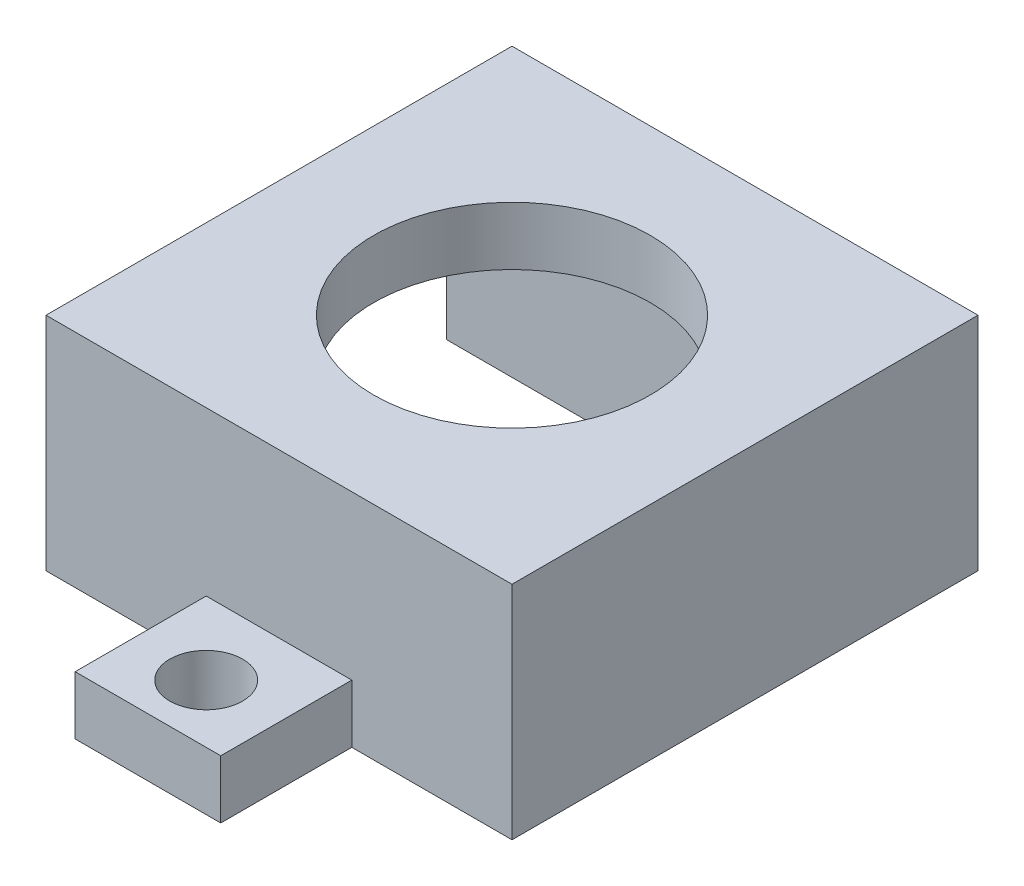
ISO-10303-21;
HEADER;
FILE_DESCRIPTION(('STEP AP214'),'2;1');
FILE_NAME('part.step','',(''),(''),'','','');
FILE_SCHEMA(('AUTOMOTIVE_DESIGN { 1 0 10303 214 1 1 1 1 }'));
ENDSEC;
DATA;
#1=APPLICATION_CONTEXT('core data for automotive mechanical design processes');
#2=APPLICATION_PROTOCOL_DEFINITION('international standard','automotive_design',2000,#1);
#3=PRODUCT_CONTEXT('',#1,'mechanical');
#4=PRODUCT('Part','Part','',(#3));
#5=PRODUCT_RELATED_PRODUCT_CATEGORY('part','',(#4));
#6=PRODUCT_DEFINITION_FORMATION('','',#4);
#7=PRODUCT_DEFINITION_CONTEXT('part definition',#1,'design');
#8=PRODUCT_DEFINITION('design','',#6,#7);
#9=PRODUCT_DEFINITION_SHAPE('','',#8);
#10=(LENGTH_UNIT() NAMED_UNIT(*) SI_UNIT(.MILLI.,.METRE.));
#11=(NAMED_UNIT(*) PLANE_ANGLE_UNIT() SI_UNIT($,.RADIAN.));
#12=(NAMED_UNIT(*) SI_UNIT($,.STERADIAN.) SOLID_ANGLE_UNIT());
#13=UNCERTAINTY_MEASURE_WITH_UNIT(LENGTH_MEASURE(1.E-05),#10,'distance_accuracy_value','');
#14=(GEOMETRIC_REPRESENTATION_CONTEXT(3) GLOBAL_UNCERTAINTY_ASSIGNED_CONTEXT((#13)) GLOBAL_UNIT_ASSIGNED_CONTEXT((#10,
#11,#12)) REPRESENTATION_CONTEXT('',''));
#15=CARTESIAN_POINT('',(0.,0.,0.));
#16=DIRECTION('',(0.,0.,1.));
#17=DIRECTION('',(1.,0.,0.));
#18=AXIS2_PLACEMENT_3D('',#15,#16,#17);
#19=CARTESIAN_POINT('',(-8.,7.6,8.));
#20=DIRECTION('',(0.,0.,-1.));
#21=DIRECTION('',(-1.,0.,0.));
#22=AXIS2_PLACEMENT_3D('',#19,#20,#21);
#23=PLANE('',#22);
#24=DIRECTION('',(0.,-1.,0.));
#25=VECTOR('',#24,1.);
#26=CARTESIAN_POINT('',(-2.5,2.,8.));
#27=LINE('',#26,#25);
#28=CARTESIAN_POINT('',(-2.5,2.,8.));
#29=VERTEX_POINT('',#28);
#30=CARTESIAN_POINT('',(-2.5,0.,8.));
#31=VERTEX_POINT('',#30);
#32=EDGE_CURVE('E195',#29,#31,#27,.T.);
#33=ORIENTED_EDGE('',*,*,#32,.F.);
#34=DIRECTION('',(1.,0.,0.));
#35=VECTOR('',#34,1.);
#36=CARTESIAN_POINT('',(-2.5,2.,8.));
#37=LINE('',#36,#35);
#38=CARTESIAN_POINT('',(2.5,2.,8.));
#39=VERTEX_POINT('',#38);
#40=EDGE_CURVE('E181',#29,#39,#37,.T.);
#41=ORIENTED_EDGE('',*,*,#40,.T.);
#42=DIRECTION('',(0.,-1.,0.));
#43=VECTOR('',#42,1.);
#44=CARTESIAN_POINT('',(2.5,2.,8.));
#45=LINE('',#44,#43);
#46=CARTESIAN_POINT('',(2.5,0.,8.));
#47=VERTEX_POINT('',#46);
#48=EDGE_CURVE('E206',#39,#47,#45,.T.);
#49=ORIENTED_EDGE('',*,*,#48,.T.);
#50=DIRECTION('',(1.,0.,0.));
#51=VECTOR('',#50,1.);
#52=CARTESIAN_POINT('',(-8.,0.,8.));
#53=LINE('',#52,#51);
#54=CARTESIAN_POINT('',(8.,0.,8.));
#55=VERTEX_POINT('',#54);
#56=EDGE_CURVE('E313',#47,#55,#53,.T.);
#57=ORIENTED_EDGE('',*,*,#56,.T.);
#58=DIRECTION('',(0.,-1.,0.));
#59=VECTOR('',#58,1.);
#60=CARTESIAN_POINT('',(8.,7.6,8.));
#61=LINE('',#60,#59);
#62=CARTESIAN_POINT('',(8.,7.6,8.));
#63=VERTEX_POINT('',#62);
#64=EDGE_CURVE('E53',#63,#55,#61,.T.);
#65=ORIENTED_EDGE('',*,*,#64,.F.);
#66=DIRECTION('',(1.,0.,0.));
#67=VECTOR('',#66,1.);
#68=CARTESIAN_POINT('',(-8.,7.6,8.));
#69=LINE('',#68,#67);
#70=CARTESIAN_POINT('',(-8.,7.6,8.));
#71=VERTEX_POINT('',#70);
#72=EDGE_CURVE('E298',#71,#63,#69,.T.);
#73=ORIENTED_EDGE('',*,*,#72,.F.);
#74=DIRECTION('',(0.,-1.,0.));
#75=VECTOR('',#74,1.);
#76=CARTESIAN_POINT('',(-8.,7.6,8.));
#77=LINE('',#76,#75);
#78=CARTESIAN_POINT('',(-8.,0.,8.));
#79=VERTEX_POINT('',#78);
#80=EDGE_CURVE('E11',#71,#79,#77,.T.);
#81=ORIENTED_EDGE('',*,*,#80,.T.);
#82=EDGE_CURVE('E314',#79,#31,#53,.T.);
#83=ORIENTED_EDGE('',*,*,#82,.T.);
#84=EDGE_LOOP('',(#33,#41,#49,#57,#65,#73,#81,#83));
#85=FACE_BOUND('',#84,.T.);
#86=ADVANCED_FACE('F43',(#85),#23,.F.);
#87=CARTESIAN_POINT('',(-8.,7.6,-8.));
#88=DIRECTION('',(0.,0.,1.));
#89=DIRECTION('',(1.,0.,0.));
#90=AXIS2_PLACEMENT_3D('',#87,#88,#89);
#91=PLANE('',#90);
#92=DIRECTION('',(0.,-1.,0.));
#93=VECTOR('',#92,1.);
#94=CARTESIAN_POINT('',(2.5,2.,-8.));
#95=LINE('',#94,#93);
#96=CARTESIAN_POINT('',(2.5,2.,-8.));
#97=VERTEX_POINT('',#96);
#98=CARTESIAN_POINT('',(2.5,0.,-8.));
#99=VERTEX_POINT('',#98);
#100=EDGE_CURVE('E245',#97,#99,#95,.T.);
#101=ORIENTED_EDGE('',*,*,#100,.F.);
#102=DIRECTION('',(1.,0.,0.));
#103=VECTOR('',#102,1.);
#104=CARTESIAN_POINT('',(-2.5,2.,-8.));
#105=LINE('',#104,#103);
#106=CARTESIAN_POINT('',(-2.5,2.,-8.));
#107=VERTEX_POINT('',#106);
#108=EDGE_CURVE('E221',#107,#97,#105,.T.);
#109=ORIENTED_EDGE('',*,*,#108,.F.);
#110=DIRECTION('',(0.,-1.,0.));
#111=VECTOR('',#110,1.);
#112=CARTESIAN_POINT('',(-2.5,2.,-8.));
#113=LINE('',#112,#111);
#114=CARTESIAN_POINT('',(-2.5,0.,-8.));
#115=VERTEX_POINT('',#114);
#116=EDGE_CURVE('E248',#107,#115,#113,.T.);
#117=ORIENTED_EDGE('',*,*,#116,.T.);
#118=DIRECTION('',(-1.,0.,0.));
#119=VECTOR('',#118,1.);
#120=CARTESIAN_POINT('',(-8.,0.,-8.));
#121=LINE('',#120,#119);
#122=CARTESIAN_POINT('',(-8.,0.,-8.));
#123=VERTEX_POINT('',#122);
#124=EDGE_CURVE('E321',#115,#123,#121,.T.);
#125=ORIENTED_EDGE('',*,*,#124,.T.);
#126=DIRECTION('',(0.,-1.,0.));
#127=VECTOR('',#126,1.);
#128=CARTESIAN_POINT('',(-8.,7.6,-8.));
#129=LINE('',#128,#127);
#130=CARTESIAN_POINT('',(-8.,7.6,-8.));
#131=VERTEX_POINT('',#130);
#132=EDGE_CURVE('E308',#131,#123,#129,.T.);
#133=ORIENTED_EDGE('',*,*,#132,.F.);
#134=DIRECTION('',(-1.,0.,0.));
#135=VECTOR('',#134,1.);
#136=CARTESIAN_POINT('',(-8.,7.6,-8.));
#137=LINE('',#136,#135);
#138=CARTESIAN_POINT('',(8.,7.6,-8.));
#139=VERTEX_POINT('',#138);
#140=EDGE_CURVE('E305',#139,#131,#137,.T.);
#141=ORIENTED_EDGE('',*,*,#140,.F.);
#142=DIRECTION('',(0.,-1.,0.));
#143=VECTOR('',#142,1.);
#144=CARTESIAN_POINT('',(8.,7.6,-8.));
#145=LINE('',#144,#143);
#146=CARTESIAN_POINT('',(8.,0.,-8.));
#147=VERTEX_POINT('',#146);
#148=EDGE_CURVE('E328',#139,#147,#145,.T.);
#149=ORIENTED_EDGE('',*,*,#148,.T.);
#150=EDGE_CURVE('E299',#147,#99,#121,.T.);
#151=ORIENTED_EDGE('',*,*,#150,.T.);
#152=EDGE_LOOP('',(#101,#109,#117,#125,#133,#141,#149,#151));
#153=FACE_BOUND('',#152,.T.);
#154=ADVANCED_FACE('F350',(#153),#91,.F.);
#155=CARTESIAN_POINT('',(0.,0.,0.));
#156=DIRECTION('',(0.,1.,0.));
#157=DIRECTION('',(0.,0.,1.));
#158=AXIS2_PLACEMENT_3D('',#155,#156,#157);
#159=PLANE('',#158);
#160=CARTESIAN_POINT('',(0.,0.,10.5));
#161=DIRECTION('',(0.,1.,0.));
#162=DIRECTION('',(0.,0.,1.));
#163=AXIS2_PLACEMENT_3D('',#160,#161,#162);
#164=CIRCLE('',#163,1.25);
#165=CARTESIAN_POINT('',(0.,0.,11.75));
#166=VERTEX_POINT('',#165);
#167=EDGE_CURVE('E509',#166,#166,#164,.T.);
#168=ORIENTED_EDGE('',*,*,#167,.T.);
#169=EDGE_LOOP('',(#168));
#170=FACE_BOUND('',#169,.T.);
#171=CARTESIAN_POINT('',(0.,0.,-10.5));
#172=DIRECTION('',(0.,1.,0.));
#173=DIRECTION('',(0.,0.,1.));
#174=AXIS2_PLACEMENT_3D('',#171,#172,#173);
#175=CIRCLE('',#174,1.25);
#176=CARTESIAN_POINT('',(0.,0.,-9.25));
#177=VERTEX_POINT('',#176);
#178=EDGE_CURVE('E214',#177,#177,#175,.F.);
#179=ORIENTED_EDGE('',*,*,#178,.F.);
#180=EDGE_LOOP('',(#179));
#181=FACE_BOUND('',#180,.T.);
#182=DIRECTION('',(0.,0.,1.));
#183=VECTOR('',#182,1.);
#184=CARTESIAN_POINT('',(-8.,0.,-8.));
#185=LINE('',#184,#183);
#186=CARTESIAN_POINT('',(-8.,0.,5.75));
#187=VERTEX_POINT('',#186);
#188=EDGE_CURVE('E293',#187,#79,#185,.T.);
#189=ORIENTED_EDGE('',*,*,#188,.F.);
#190=DIRECTION('',(1.,0.,0.));
#191=VECTOR('',#190,1.);
#192=CARTESIAN_POINT('',(-5.75,0.,5.75));
#193=LINE('',#192,#191);
#194=CARTESIAN_POINT('',(5.75,0.,5.75));
#195=VERTEX_POINT('',#194);
#196=EDGE_CURVE('E264',#187,#195,#193,.T.);
#197=ORIENTED_EDGE('',*,*,#196,.T.);
#198=DIRECTION('',(0.,0.,-1.));
#199=VECTOR('',#198,1.);
#200=CARTESIAN_POINT('',(5.75,0.,-5.75));
#201=LINE('',#200,#199);
#202=CARTESIAN_POINT('',(5.75,0.,-5.75));
#203=VERTEX_POINT('',#202);
#204=EDGE_CURVE('E282',#195,#203,#201,.T.);
#205=ORIENTED_EDGE('',*,*,#204,.T.);
#206=DIRECTION('',(-1.,0.,0.));
#207=VECTOR('',#206,1.);
#208=CARTESIAN_POINT('',(-5.75,0.,-5.75));
#209=LINE('',#208,#207);
#210=CARTESIAN_POINT('',(-8.,0.,-5.75));
#211=VERTEX_POINT('',#210);
#212=EDGE_CURVE('E272',#203,#211,#209,.T.);
#213=ORIENTED_EDGE('',*,*,#212,.T.);
#214=EDGE_CURVE('E309',#123,#211,#185,.T.);
#215=ORIENTED_EDGE('',*,*,#214,.F.);
#216=ORIENTED_EDGE('',*,*,#124,.F.);
#217=DIRECTION('',(0.,0.,1.));
#218=VECTOR('',#217,1.);
#219=CARTESIAN_POINT('',(-2.5,0.,-8.));
#220=LINE('',#219,#218);
#221=CARTESIAN_POINT('',(-2.5,0.,-12.5));
#222=VERTEX_POINT('',#221);
#223=EDGE_CURVE('E68',#222,#115,#220,.T.);
#224=ORIENTED_EDGE('',*,*,#223,.F.);
#225=DIRECTION('',(-1.,0.,0.));
#226=VECTOR('',#225,1.);
#227=CARTESIAN_POINT('',(-2.5,0.,-12.5));
#228=LINE('',#227,#226);
#229=CARTESIAN_POINT('',(2.5,0.,-12.5));
#230=VERTEX_POINT('',#229);
#231=EDGE_CURVE('E222',#230,#222,#228,.T.);
#232=ORIENTED_EDGE('',*,*,#231,.F.);
#233=DIRECTION('',(0.,0.,-1.));
#234=VECTOR('',#233,1.);
#235=CARTESIAN_POINT('',(2.5,0.,-8.));
#236=LINE('',#235,#234);
#237=EDGE_CURVE('E234',#99,#230,#236,.T.);
#238=ORIENTED_EDGE('',*,*,#237,.F.);
#239=ORIENTED_EDGE('',*,*,#150,.F.);
#240=DIRECTION('',(0.,0.,-1.));
#241=VECTOR('',#240,1.);
#242=CARTESIAN_POINT('',(8.,0.,-8.));
#243=LINE('',#242,#241);
#244=EDGE_CURVE('E318',#55,#147,#243,.T.);
#245=ORIENTED_EDGE('',*,*,#244,.F.);
#246=ORIENTED_EDGE('',*,*,#56,.F.);
#247=DIRECTION('',(0.,0.,1.));
#248=VECTOR('',#247,1.);
#249=CARTESIAN_POINT('',(2.5,0.,8.));
#250=LINE('',#249,#248);
#251=CARTESIAN_POINT('',(2.5,0.,12.5));
#252=VERTEX_POINT('',#251);
#253=EDGE_CURVE('E60',#47,#252,#250,.T.);
#254=ORIENTED_EDGE('',*,*,#253,.T.);
#255=DIRECTION('',(-1.,0.,0.));
#256=VECTOR('',#255,1.);
#257=CARTESIAN_POINT('',(-2.5,0.,12.5));
#258=LINE('',#257,#256);
#259=CARTESIAN_POINT('',(-2.5,0.,12.5));
#260=VERTEX_POINT('',#259);
#261=EDGE_CURVE('E198',#252,#260,#258,.T.);
#262=ORIENTED_EDGE('',*,*,#261,.T.);
#263=DIRECTION('',(0.,0.,-1.));
#264=VECTOR('',#263,1.);
#265=CARTESIAN_POINT('',(-2.5,0.,8.));
#266=LINE('',#265,#264);
#267=EDGE_CURVE('E165',#260,#31,#266,.T.);
#268=ORIENTED_EDGE('',*,*,#267,.T.);
#269=ORIENTED_EDGE('',*,*,#82,.F.);
#270=EDGE_LOOP('',(#189,#197,#205,#213,#215,#216,#224,#232,#238,#239,#245,#246,#254,#262,#268,#269));
#271=FACE_BOUND('',#270,.T.);
#272=ADVANCED_FACE('F345',(#170,#181,#271),#159,.F.);
#273=CARTESIAN_POINT('',(-8.,7.6,-8.));
#274=DIRECTION('',(1.,0.,0.));
#275=DIRECTION('',(0.,0.,-1.));
#276=AXIS2_PLACEMENT_3D('',#273,#274,#275);
#277=PLANE('',#276);
#278=DIRECTION('',(0.,0.,-1.));
#279=VECTOR('',#278,1.);
#280=CARTESIAN_POINT('',(-8.,5.6,5.75));
#281=LINE('',#280,#279);
#282=CARTESIAN_POINT('',(-8.,5.6,5.75));
#283=VERTEX_POINT('',#282);
#284=CARTESIAN_POINT('',(-8.,5.6,-5.75));
#285=VERTEX_POINT('',#284);
#286=EDGE_CURVE('E255',#283,#285,#281,.T.);
#287=ORIENTED_EDGE('',*,*,#286,.F.);
#288=DIRECTION('',(0.,-1.,0.));
#289=VECTOR('',#288,1.);
#290=CARTESIAN_POINT('',(-8.,17.318041645258,5.75));
#291=LINE('',#290,#289);
#292=EDGE_CURVE('E260',#283,#187,#291,.T.);
#293=ORIENTED_EDGE('',*,*,#292,.T.);
#294=ORIENTED_EDGE('',*,*,#188,.T.);
#295=ORIENTED_EDGE('',*,*,#80,.F.);
#296=DIRECTION('',(0.,0.,1.));
#297=VECTOR('',#296,1.);
#298=CARTESIAN_POINT('',(-8.,7.6,-8.));
#299=LINE('',#298,#297);
#300=EDGE_CURVE('E294',#131,#71,#299,.T.);
#301=ORIENTED_EDGE('',*,*,#300,.F.);
#302=ORIENTED_EDGE('',*,*,#132,.T.);
#303=ORIENTED_EDGE('',*,*,#214,.T.);
#304=DIRECTION('',(0.,-1.,0.));
#305=VECTOR('',#304,1.);
#306=CARTESIAN_POINT('',(-8.,17.318041645258,-5.75));
#307=LINE('',#306,#305);
#308=EDGE_CURVE('E259',#285,#211,#307,.T.);
#309=ORIENTED_EDGE('',*,*,#308,.F.);
#310=EDGE_LOOP('',(#287,#293,#294,#295,#301,#302,#303,#309));
#311=FACE_BOUND('',#310,.T.);
#312=ADVANCED_FACE('F45',(#311),#277,.F.);
#313=CARTESIAN_POINT('',(8.,7.6,-8.));
#314=DIRECTION('',(-1.,0.,0.));
#315=DIRECTION('',(0.,0.,1.));
#316=AXIS2_PLACEMENT_3D('',#313,#314,#315);
#317=PLANE('',#316);
#318=ORIENTED_EDGE('',*,*,#244,.T.);
#319=ORIENTED_EDGE('',*,*,#148,.F.);
#320=DIRECTION('',(0.,0.,-1.));
#321=VECTOR('',#320,1.);
#322=CARTESIAN_POINT('',(8.,7.6,-8.));
#323=LINE('',#322,#321);
#324=EDGE_CURVE('E302',#63,#139,#323,.T.);
#325=ORIENTED_EDGE('',*,*,#324,.F.);
#326=ORIENTED_EDGE('',*,*,#64,.T.);
#327=EDGE_LOOP('',(#318,#319,#325,#326));
#328=FACE_BOUND('',#327,.T.);
#329=ADVANCED_FACE('F338',(#328),#317,.F.);
#330=CARTESIAN_POINT('',(0.,7.6,0.));
#331=DIRECTION('',(0.,1.,0.));
#332=DIRECTION('',(0.,0.,1.));
#333=AXIS2_PLACEMENT_3D('',#330,#331,#332);
#334=PLANE('',#333);
#335=CARTESIAN_POINT('',(0.,7.6,0.));
#336=DIRECTION('',(0.,1.,0.));
#337=DIRECTION('',(0.,0.,1.));
#338=AXIS2_PLACEMENT_3D('',#335,#336,#337);
#339=CIRCLE('',#338,4.75);
#340=CARTESIAN_POINT('',(0.,7.6,4.75));
#341=VERTEX_POINT('',#340);
#342=EDGE_CURVE('E251',#341,#341,#339,.T.);
#343=ORIENTED_EDGE('',*,*,#342,.F.);
#344=EDGE_LOOP('',(#343));
#345=FACE_BOUND('',#344,.T.);
#346=ORIENTED_EDGE('',*,*,#300,.T.);
#347=ORIENTED_EDGE('',*,*,#72,.T.);
#348=ORIENTED_EDGE('',*,*,#324,.T.);
#349=ORIENTED_EDGE('',*,*,#140,.T.);
#350=EDGE_LOOP('',(#346,#347,#348,#349));
#351=FACE_BOUND('',#350,.T.);
#352=ADVANCED_FACE('F356',(#345,#351),#334,.T.);
#353=CARTESIAN_POINT('',(-5.75,5.6,5.75));
#354=DIRECTION('',(0.,0.,-1.));
#355=DIRECTION('',(-1.,0.,0.));
#356=AXIS2_PLACEMENT_3D('',#353,#354,#355);
#357=PLANE('',#356);
#358=ORIENTED_EDGE('',*,*,#196,.F.);
#359=ORIENTED_EDGE('',*,*,#292,.F.);
#360=DIRECTION('',(1.,0.,0.));
#361=VECTOR('',#360,1.);
#362=CARTESIAN_POINT('',(-5.75,5.6,5.75));
#363=LINE('',#362,#361);
#364=CARTESIAN_POINT('',(5.75,5.6,5.75));
#365=VERTEX_POINT('',#364);
#366=EDGE_CURVE('E268',#283,#365,#363,.T.);
#367=ORIENTED_EDGE('',*,*,#366,.T.);
#368=DIRECTION('',(0.,-1.,0.));
#369=VECTOR('',#368,1.);
#370=CARTESIAN_POINT('',(5.75,5.6,5.75));
#371=LINE('',#370,#369);
#372=EDGE_CURVE('E290',#365,#195,#371,.T.);
#373=ORIENTED_EDGE('',*,*,#372,.T.);
#374=EDGE_LOOP('',(#358,#359,#367,#373));
#375=FACE_BOUND('',#374,.T.);
#376=ADVANCED_FACE('F398',(#375),#357,.T.);
#377=CARTESIAN_POINT('',(5.75,5.6,-5.75));
#378=DIRECTION('',(-1.,0.,0.));
#379=DIRECTION('',(0.,0.,1.));
#380=AXIS2_PLACEMENT_3D('',#377,#378,#379);
#381=PLANE('',#380);
#382=ORIENTED_EDGE('',*,*,#204,.F.);
#383=ORIENTED_EDGE('',*,*,#372,.F.);
#384=DIRECTION('',(0.,0.,-1.));
#385=VECTOR('',#384,1.);
#386=CARTESIAN_POINT('',(5.75,5.6,-5.75));
#387=LINE('',#386,#385);
#388=CARTESIAN_POINT('',(5.75,5.6,-5.75));
#389=VERTEX_POINT('',#388);
#390=EDGE_CURVE('E271',#365,#389,#387,.T.);
#391=ORIENTED_EDGE('',*,*,#390,.T.);
#392=DIRECTION('',(0.,-1.,0.));
#393=VECTOR('',#392,1.);
#394=CARTESIAN_POINT('',(5.75,5.6,-5.75));
#395=LINE('',#394,#393);
#396=EDGE_CURVE('E278',#389,#203,#395,.T.);
#397=ORIENTED_EDGE('',*,*,#396,.T.);
#398=EDGE_LOOP('',(#382,#383,#391,#397));
#399=FACE_BOUND('',#398,.T.);
#400=ADVANCED_FACE('F402',(#399),#381,.T.);
#401=CARTESIAN_POINT('',(-5.75,5.6,-5.75));
#402=DIRECTION('',(0.,0.,1.));
#403=DIRECTION('',(1.,0.,0.));
#404=AXIS2_PLACEMENT_3D('',#401,#402,#403);
#405=PLANE('',#404);
#406=ORIENTED_EDGE('',*,*,#212,.F.);
#407=ORIENTED_EDGE('',*,*,#396,.F.);
#408=DIRECTION('',(-1.,0.,0.));
#409=VECTOR('',#408,1.);
#410=CARTESIAN_POINT('',(-5.75,5.6,-5.75));
#411=LINE('',#410,#409);
#412=EDGE_CURVE('E275',#389,#285,#411,.T.);
#413=ORIENTED_EDGE('',*,*,#412,.T.);
#414=ORIENTED_EDGE('',*,*,#308,.T.);
#415=EDGE_LOOP('',(#406,#407,#413,#414));
#416=FACE_BOUND('',#415,.T.);
#417=ADVANCED_FACE('F383',(#416),#405,.T.);
#418=CARTESIAN_POINT('',(0.,5.6,0.));
#419=DIRECTION('',(0.,1.,0.));
#420=DIRECTION('',(0.,0.,1.));
#421=AXIS2_PLACEMENT_3D('',#418,#419,#420);
#422=PLANE('',#421);
#423=CARTESIAN_POINT('',(0.,5.6,0.));
#424=DIRECTION('',(0.,1.,0.));
#425=DIRECTION('',(0.,0.,1.));
#426=AXIS2_PLACEMENT_3D('',#423,#424,#425);
#427=CIRCLE('',#426,4.75);
#428=CARTESIAN_POINT('',(0.,5.6,4.75));
#429=VERTEX_POINT('',#428);
#430=EDGE_CURVE('E47',#429,#429,#427,.T.);
#431=ORIENTED_EDGE('',*,*,#430,.T.);
#432=EDGE_LOOP('',(#431));
#433=FACE_BOUND('',#432,.T.);
#434=ORIENTED_EDGE('',*,*,#366,.F.);
#435=ORIENTED_EDGE('',*,*,#286,.T.);
#436=ORIENTED_EDGE('',*,*,#412,.F.);
#437=ORIENTED_EDGE('',*,*,#390,.F.);
#438=EDGE_LOOP('',(#434,#435,#436,#437));
#439=FACE_BOUND('',#438,.T.);
#440=ADVANCED_FACE('F368',(#433,#439),#422,.F.);
#441=CARTESIAN_POINT('',(0.,0.,0.));
#442=DIRECTION('',(0.,1.,0.));
#443=DIRECTION('',(0.,0.,1.));
#444=AXIS2_PLACEMENT_3D('',#441,#442,#443);
#445=CYLINDRICAL_SURFACE('',#444,4.75);
#446=CARTESIAN_POINT('',(0.,7.6,4.75));
#447=CARTESIAN_POINT('',(0.,7.57916666666667,4.75));
#448=CARTESIAN_POINT('',(0.,7.55833333333333,4.75));
#449=CARTESIAN_POINT('',(0.,7.51666666666667,4.75));
#450=CARTESIAN_POINT('',(0.,7.49583333333333,4.75));
#451=CARTESIAN_POINT('',(0.,7.45416666666667,4.75));
#452=CARTESIAN_POINT('',(0.,7.43333333333333,4.75));
#453=CARTESIAN_POINT('',(0.,7.39166666666667,4.75));
#454=CARTESIAN_POINT('',(0.,7.37083333333333,4.75));
#455=CARTESIAN_POINT('',(0.,7.32916666666667,4.75));
#456=CARTESIAN_POINT('',(0.,7.30833333333333,4.75));
#457=CARTESIAN_POINT('',(0.,7.26666666666667,4.75));
#458=CARTESIAN_POINT('',(0.,7.24583333333333,4.75));
#459=CARTESIAN_POINT('',(0.,7.20416666666667,4.75));
#460=CARTESIAN_POINT('',(0.,7.18333333333333,4.75));
#461=CARTESIAN_POINT('',(0.,7.14166666666667,4.75));
#462=CARTESIAN_POINT('',(0.,7.12083333333333,4.75));
#463=CARTESIAN_POINT('',(0.,7.07916666666667,4.75));
#464=CARTESIAN_POINT('',(0.,7.05833333333333,4.75));
#465=CARTESIAN_POINT('',(0.,7.01666666666667,4.75));
#466=CARTESIAN_POINT('',(0.,6.99583333333333,4.75));
#467=CARTESIAN_POINT('',(0.,6.95416666666667,4.75));
#468=CARTESIAN_POINT('',(0.,6.93333333333333,4.75));
#469=CARTESIAN_POINT('',(0.,6.89166666666667,4.75));
#470=CARTESIAN_POINT('',(0.,6.87083333333333,4.75));
#471=CARTESIAN_POINT('',(0.,6.82916666666667,4.75));
#472=CARTESIAN_POINT('',(0.,6.80833333333333,4.75));
#473=CARTESIAN_POINT('',(0.,6.76666666666667,4.75));
#474=CARTESIAN_POINT('',(0.,6.74583333333333,4.75));
#475=CARTESIAN_POINT('',(0.,6.70416666666667,4.75));
#476=CARTESIAN_POINT('',(0.,6.68333333333333,4.75));
#477=CARTESIAN_POINT('',(0.,6.64166666666667,4.75));
#478=CARTESIAN_POINT('',(0.,6.62083333333333,4.75));
#479=CARTESIAN_POINT('',(0.,6.57916666666667,4.75));
#480=CARTESIAN_POINT('',(0.,6.55833333333333,4.75));
#481=CARTESIAN_POINT('',(0.,6.51666666666667,4.75));
#482=CARTESIAN_POINT('',(0.,6.49583333333333,4.75));
#483=CARTESIAN_POINT('',(0.,6.45416666666667,4.75));
#484=CARTESIAN_POINT('',(0.,6.43333333333333,4.75));
#485=CARTESIAN_POINT('',(0.,6.39166666666667,4.75));
#486=CARTESIAN_POINT('',(0.,6.37083333333333,4.75));
#487=CARTESIAN_POINT('',(0.,6.32916666666667,4.75));
#488=CARTESIAN_POINT('',(0.,6.30833333333333,4.75));
#489=CARTESIAN_POINT('',(0.,6.26666666666667,4.75));
#490=CARTESIAN_POINT('',(0.,6.24583333333333,4.75));
#491=CARTESIAN_POINT('',(0.,6.20416666666667,4.75));
#492=CARTESIAN_POINT('',(0.,6.18333333333333,4.75));
#493=CARTESIAN_POINT('',(0.,6.14166666666667,4.75));
#494=CARTESIAN_POINT('',(0.,6.12083333333333,4.75));
#495=CARTESIAN_POINT('',(0.,6.07916666666667,4.75));
#496=CARTESIAN_POINT('',(0.,6.05833333333333,4.75));
#497=CARTESIAN_POINT('',(0.,6.01666666666667,4.75));
#498=CARTESIAN_POINT('',(0.,5.99583333333333,4.75));
#499=CARTESIAN_POINT('',(0.,5.95416666666667,4.75));
#500=CARTESIAN_POINT('',(0.,5.93333333333333,4.75));
#501=CARTESIAN_POINT('',(0.,5.89166666666667,4.75));
#502=CARTESIAN_POINT('',(0.,5.87083333333333,4.75));
#503=CARTESIAN_POINT('',(0.,5.82916666666667,4.75));
#504=CARTESIAN_POINT('',(0.,5.80833333333333,4.75));
#505=CARTESIAN_POINT('',(0.,5.76666666666667,4.75));
#506=CARTESIAN_POINT('',(0.,5.74583333333333,4.75));
#507=CARTESIAN_POINT('',(0.,5.70416666666667,4.75));
#508=CARTESIAN_POINT('',(0.,5.68333333333333,4.75));
#509=CARTESIAN_POINT('',(0.,5.64166666666667,4.75));
#510=CARTESIAN_POINT('',(0.,5.62083333333333,4.75));
#511=CARTESIAN_POINT('',(0.,5.6,4.75));
#512=B_SPLINE_CURVE_WITH_KNOTS('',3,(#446,#447,#448,#449,#450,#451,#452,#453,#454,#455,#456,
#457,#458,#459,#460,#461,#462,#463,#464,#465,#466,#467,#468,#469,#470,#471,#472,#473,#474,#475,
#476,#477,#478,#479,#480,#481,#482,#483,#484,#485,#486,#487,#488,#489,#490,#491,#492,#493,#494,
#495,#496,#497,#498,#499,#500,#501,#502,#503,#504,#505,#506,#507,#508,#509,#510,#511),
.UNSPECIFIED.,.F.,.F.,(4,2,2,2,2,2,2,2,2,2,2,2,2,2,2,2,2,2,2,2,2,2,2,2,2,2,2,2,2,2,2,2,4),(0.,
0.0625000000000001,0.125,0.1875,0.25,0.3125,0.375,0.4375,0.5,0.5625,0.625,0.6875,0.75,0.8125,
0.875,0.9375,1.,1.0625,1.125,1.1875,1.25,1.3125,1.375,1.4375,1.5,1.5625,1.625,1.6875,1.75,
1.8125,1.875,1.9375,2.),.UNSPECIFIED.);
#513=EDGE_CURVE('BSEAM371',#341,#429,#512,.T.);
#514=ORIENTED_EDGE('',*,*,#342,.T.);
#515=ORIENTED_EDGE('',*,*,#430,.F.);
#516=ORIENTED_EDGE('',*,*,#513,.T.);
#517=ORIENTED_EDGE('',*,*,#513,.F.);
#518=EDGE_LOOP('',(#514,#516,#515,#517));
#519=FACE_BOUND('',#518,.T.);
#520=ADVANCED_FACE('F371',(#519),#445,.F.);
#521=CARTESIAN_POINT('',(-2.5,2.,-8.));
#522=DIRECTION('',(1.,0.,0.));
#523=DIRECTION('',(0.,0.,-1.));
#524=AXIS2_PLACEMENT_3D('',#521,#522,#523);
#525=PLANE('',#524);
#526=ORIENTED_EDGE('',*,*,#223,.T.);
#527=ORIENTED_EDGE('',*,*,#116,.F.);
#528=DIRECTION('',(0.,0.,1.));
#529=VECTOR('',#528,1.);
#530=CARTESIAN_POINT('',(-2.5,2.,-8.));
#531=LINE('',#530,#529);
#532=CARTESIAN_POINT('',(-2.5,2.,-12.5));
#533=VERTEX_POINT('',#532);
#534=EDGE_CURVE('E218',#533,#107,#531,.T.);
#535=ORIENTED_EDGE('',*,*,#534,.F.);
#536=DIRECTION('',(0.,-1.,0.));
#537=VECTOR('',#536,1.);
#538=CARTESIAN_POINT('',(-2.5,2.,-12.5));
#539=LINE('',#538,#537);
#540=EDGE_CURVE('E231',#533,#222,#539,.T.);
#541=ORIENTED_EDGE('',*,*,#540,.T.);
#542=EDGE_LOOP('',(#526,#527,#535,#541));
#543=FACE_BOUND('',#542,.T.);
#544=ADVANCED_FACE('F373',(#543),#525,.F.);
#545=CARTESIAN_POINT('',(2.5,2.,-8.));
#546=DIRECTION('',(-1.,0.,0.));
#547=DIRECTION('',(0.,0.,1.));
#548=AXIS2_PLACEMENT_3D('',#545,#546,#547);
#549=PLANE('',#548);
#550=ORIENTED_EDGE('',*,*,#237,.T.);
#551=DIRECTION('',(0.,-1.,0.));
#552=VECTOR('',#551,1.);
#553=CARTESIAN_POINT('',(2.5,2.,-12.5));
#554=LINE('',#553,#552);
#555=CARTESIAN_POINT('',(2.5,2.,-12.5));
#556=VERTEX_POINT('',#555);
#557=EDGE_CURVE('E241',#556,#230,#554,.T.);
#558=ORIENTED_EDGE('',*,*,#557,.F.);
#559=DIRECTION('',(0.,0.,-1.));
#560=VECTOR('',#559,1.);
#561=CARTESIAN_POINT('',(2.5,2.,-8.));
#562=LINE('',#561,#560);
#563=EDGE_CURVE('E225',#97,#556,#562,.T.);
#564=ORIENTED_EDGE('',*,*,#563,.F.);
#565=ORIENTED_EDGE('',*,*,#100,.T.);
#566=EDGE_LOOP('',(#550,#558,#564,#565));
#567=FACE_BOUND('',#566,.T.);
#568=ADVANCED_FACE('F381',(#567),#549,.F.);
#569=CARTESIAN_POINT('',(-2.5,2.,-12.5));
#570=DIRECTION('',(0.,0.,1.));
#571=DIRECTION('',(1.,0.,0.));
#572=AXIS2_PLACEMENT_3D('',#569,#570,#571);
#573=PLANE('',#572);
#574=ORIENTED_EDGE('',*,*,#231,.T.);
#575=ORIENTED_EDGE('',*,*,#540,.F.);
#576=DIRECTION('',(-1.,0.,0.));
#577=VECTOR('',#576,1.);
#578=CARTESIAN_POINT('',(-2.5,2.,-12.5));
#579=LINE('',#578,#577);
#580=EDGE_CURVE('E228',#556,#533,#579,.T.);
#581=ORIENTED_EDGE('',*,*,#580,.F.);
#582=ORIENTED_EDGE('',*,*,#557,.T.);
#583=EDGE_LOOP('',(#574,#575,#581,#582));
#584=FACE_BOUND('',#583,.T.);
#585=ADVANCED_FACE('F442',(#584),#573,.F.);
#586=CARTESIAN_POINT('',(0.,2.,0.));
#587=DIRECTION('',(0.,-1.,0.));
#588=DIRECTION('',(0.,0.,-1.));
#589=AXIS2_PLACEMENT_3D('',#586,#587,#588);
#590=PLANE('',#589);
#591=CARTESIAN_POINT('',(0.,2.,-10.5));
#592=DIRECTION('',(0.,1.,0.));
#593=DIRECTION('',(0.,0.,1.));
#594=AXIS2_PLACEMENT_3D('',#591,#592,#593);
#595=CIRCLE('',#594,1.25);
#596=CARTESIAN_POINT('',(0.,2.,-9.25));
#597=VERTEX_POINT('',#596);
#598=EDGE_CURVE('E171',#597,#597,#595,.T.);
#599=ORIENTED_EDGE('',*,*,#598,.F.);
#600=EDGE_LOOP('',(#599));
#601=FACE_BOUND('',#600,.T.);
#602=ORIENTED_EDGE('',*,*,#534,.T.);
#603=ORIENTED_EDGE('',*,*,#108,.T.);
#604=ORIENTED_EDGE('',*,*,#563,.T.);
#605=ORIENTED_EDGE('',*,*,#580,.T.);
#606=EDGE_LOOP('',(#602,#603,#604,#605));
#607=FACE_BOUND('',#606,.T.);
#608=ADVANCED_FACE('F438',(#601,#607),#590,.F.);
#609=CARTESIAN_POINT('',(0.,-0.00100000000000013,-10.5));
#610=DIRECTION('',(0.,1.,0.));
#611=DIRECTION('',(0.,0.,1.));
#612=AXIS2_PLACEMENT_3D('',#609,#610,#611);
#613=CYLINDRICAL_SURFACE('',#612,1.25);
#614=ORIENTED_EDGE('',*,*,#598,.T.);
#615=EDGE_LOOP('',(#614));
#616=FACE_BOUND('',#615,.T.);
#617=ORIENTED_EDGE('',*,*,#178,.T.);
#618=EDGE_LOOP('',(#617));
#619=FACE_BOUND('',#618,.T.);
#620=ADVANCED_FACE('F436',(#616,#619),#613,.F.);
#621=CARTESIAN_POINT('',(-2.5,2.,8.));
#622=DIRECTION('',(-1.,0.,0.));
#623=DIRECTION('',(0.,0.,1.));
#624=AXIS2_PLACEMENT_3D('',#621,#622,#623);
#625=PLANE('',#624);
#626=ORIENTED_EDGE('',*,*,#267,.F.);
#627=DIRECTION('',(0.,-1.,0.));
#628=VECTOR('',#627,1.);
#629=CARTESIAN_POINT('',(-2.5,2.,12.5));
#630=LINE('',#629,#628);
#631=CARTESIAN_POINT('',(-2.5,2.,12.5));
#632=VERTEX_POINT('',#631);
#633=EDGE_CURVE('E159',#632,#260,#630,.T.);
#634=ORIENTED_EDGE('',*,*,#633,.F.);
#635=DIRECTION('',(0.,0.,-1.));
#636=VECTOR('',#635,1.);
#637=CARTESIAN_POINT('',(-2.5,2.,8.));
#638=LINE('',#637,#636);
#639=EDGE_CURVE('E162',#632,#29,#638,.T.);
#640=ORIENTED_EDGE('',*,*,#639,.T.);
#641=ORIENTED_EDGE('',*,*,#32,.T.);
#642=EDGE_LOOP('',(#626,#634,#640,#641));
#643=FACE_BOUND('',#642,.T.);
#644=ADVANCED_FACE('F161',(#643),#625,.T.);
#645=CARTESIAN_POINT('',(-2.5,2.,12.5));
#646=DIRECTION('',(0.,0.,1.));
#647=DIRECTION('',(1.,0.,0.));
#648=AXIS2_PLACEMENT_3D('',#645,#646,#647);
#649=PLANE('',#648);
#650=ORIENTED_EDGE('',*,*,#261,.F.);
#651=DIRECTION('',(0.,-1.,0.));
#652=VECTOR('',#651,1.);
#653=CARTESIAN_POINT('',(2.5,2.,12.5));
#654=LINE('',#653,#652);
#655=CARTESIAN_POINT('',(2.5,2.,12.5));
#656=VERTEX_POINT('',#655);
#657=EDGE_CURVE('E172',#656,#252,#654,.T.);
#658=ORIENTED_EDGE('',*,*,#657,.F.);
#659=DIRECTION('',(-1.,0.,0.));
#660=VECTOR('',#659,1.);
#661=CARTESIAN_POINT('',(-2.5,2.,12.5));
#662=LINE('',#661,#660);
#663=EDGE_CURVE('E178',#656,#632,#662,.T.);
#664=ORIENTED_EDGE('',*,*,#663,.T.);
#665=ORIENTED_EDGE('',*,*,#633,.T.);
#666=EDGE_LOOP('',(#650,#658,#664,#665));
#667=FACE_BOUND('',#666,.T.);
#668=ADVANCED_FACE('F185',(#667),#649,.T.);
#669=CARTESIAN_POINT('',(2.5,2.,8.));
#670=DIRECTION('',(1.,0.,0.));
#671=DIRECTION('',(0.,0.,-1.));
#672=AXIS2_PLACEMENT_3D('',#669,#670,#671);
#673=PLANE('',#672);
#674=ORIENTED_EDGE('',*,*,#253,.F.);
#675=ORIENTED_EDGE('',*,*,#48,.F.);
#676=DIRECTION('',(0.,0.,1.));
#677=VECTOR('',#676,1.);
#678=CARTESIAN_POINT('',(2.5,2.,8.));
#679=LINE('',#678,#677);
#680=EDGE_CURVE('E187',#39,#656,#679,.T.);
#681=ORIENTED_EDGE('',*,*,#680,.T.);
#682=ORIENTED_EDGE('',*,*,#657,.T.);
#683=EDGE_LOOP('',(#674,#675,#681,#682));
#684=FACE_BOUND('',#683,.T.);
#685=ADVANCED_FACE('F421',(#684),#673,.T.);
#686=CARTESIAN_POINT('',(0.,2.,0.));
#687=DIRECTION('',(0.,-1.,0.));
#688=DIRECTION('',(0.,0.,1.));
#689=AXIS2_PLACEMENT_3D('',#686,#687,#688);
#690=PLANE('',#689);
#691=CARTESIAN_POINT('',(0.,2.,10.5));
#692=DIRECTION('',(0.,-1.,0.));
#693=DIRECTION('',(0.,0.,-1.));
#694=AXIS2_PLACEMENT_3D('',#691,#692,#693);
#695=CIRCLE('',#694,1.25);
#696=CARTESIAN_POINT('',(0.,2.,9.25));
#697=VERTEX_POINT('',#696);
#698=EDGE_CURVE('E199',#697,#697,#695,.T.);
#699=ORIENTED_EDGE('',*,*,#698,.T.);
#700=EDGE_LOOP('',(#699));
#701=FACE_BOUND('',#700,.T.);
#702=ORIENTED_EDGE('',*,*,#639,.F.);
#703=ORIENTED_EDGE('',*,*,#663,.F.);
#704=ORIENTED_EDGE('',*,*,#680,.F.);
#705=ORIENTED_EDGE('',*,*,#40,.F.);
#706=EDGE_LOOP('',(#702,#703,#704,#705));
#707=FACE_BOUND('',#706,.T.);
#708=ADVANCED_FACE('F176',(#701,#707),#690,.F.);
#709=CARTESIAN_POINT('',(0.,-0.00100000000000013,10.5));
#710=DIRECTION('',(0.,1.,0.));
#711=DIRECTION('',(0.,0.,1.));
#712=AXIS2_PLACEMENT_3D('',#709,#710,#711);
#713=CYLINDRICAL_SURFACE('',#712,1.25);
#714=ORIENTED_EDGE('',*,*,#698,.F.);
#715=EDGE_LOOP('',(#714));
#716=FACE_BOUND('',#715,.T.);
#717=ORIENTED_EDGE('',*,*,#167,.F.);
#718=EDGE_LOOP('',(#717));
#719=FACE_BOUND('',#718,.T.);
#720=ADVANCED_FACE('F428',(#716,#719),#713,.F.);
#721=CLOSED_SHELL('',(#86,#154,#272,#312,#329,#352,#376,#400,#417,#440,#520,#544,#568,#585,#608,
#620,#644,#668,#685,#708,#720));
#722=MANIFOLD_SOLID_BREP('B2',#721);
#723=ADVANCED_BREP_SHAPE_REPRESENTATION('',(#18,#722),#14);
#724=SHAPE_DEFINITION_REPRESENTATION(#9,#723);
ENDSEC;
END-ISO-10303-21;
